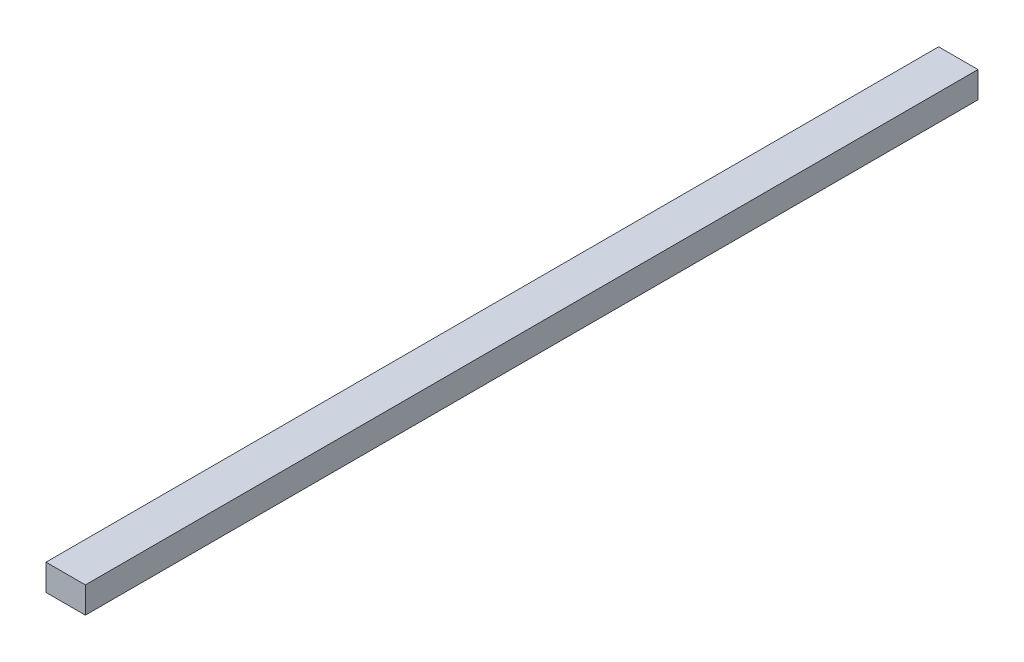
ISO-10303-21;
HEADER;
FILE_DESCRIPTION(('STEP AP214'),'2;1');
FILE_NAME('part.step','',(''),(''),'','','');
FILE_SCHEMA(('AUTOMOTIVE_DESIGN { 1 0 10303 214 1 1 1 1 }'));
ENDSEC;
DATA;
#1=APPLICATION_CONTEXT('core data for automotive mechanical design processes');
#2=APPLICATION_PROTOCOL_DEFINITION('international standard','automotive_design',2000,#1);
#3=PRODUCT_CONTEXT('',#1,'mechanical');
#4=PRODUCT('Part','Part','',(#3));
#5=PRODUCT_RELATED_PRODUCT_CATEGORY('part','',(#4));
#6=PRODUCT_DEFINITION_FORMATION('','',#4);
#7=PRODUCT_DEFINITION_CONTEXT('part definition',#1,'design');
#8=PRODUCT_DEFINITION('design','',#6,#7);
#9=PRODUCT_DEFINITION_SHAPE('','',#8);
#10=(LENGTH_UNIT() NAMED_UNIT(*) SI_UNIT(.MILLI.,.METRE.));
#11=(NAMED_UNIT(*) PLANE_ANGLE_UNIT() SI_UNIT($,.RADIAN.));
#12=(NAMED_UNIT(*) SI_UNIT($,.STERADIAN.) SOLID_ANGLE_UNIT());
#13=UNCERTAINTY_MEASURE_WITH_UNIT(LENGTH_MEASURE(1.E-05),#10,'distance_accuracy_value','');
#14=(GEOMETRIC_REPRESENTATION_CONTEXT(3) GLOBAL_UNCERTAINTY_ASSIGNED_CONTEXT((#13)) GLOBAL_UNIT_ASSIGNED_CONTEXT((#10,
#11,#12)) REPRESENTATION_CONTEXT('',''));
#15=CARTESIAN_POINT('',(0.,0.,0.));
#16=DIRECTION('',(0.,0.,1.));
#17=DIRECTION('',(1.,0.,0.));
#18=AXIS2_PLACEMENT_3D('',#15,#16,#17);
#19=CARTESIAN_POINT('',(-65.,0.,-700.));
#20=DIRECTION('',(-1.,0.,0.));
#21=DIRECTION('',(0.,0.,1.));
#22=AXIS2_PLACEMENT_3D('',#19,#20,#21);
#23=PLANE('',#22);
#24=DIRECTION('',(0.,-1.,0.));
#25=VECTOR('',#24,1.);
#26=CARTESIAN_POINT('',(-65.,0.,-20.));
#27=LINE('',#26,#25);
#28=CARTESIAN_POINT('',(-65.,20.,-20.));
#29=VERTEX_POINT('',#28);
#30=CARTESIAN_POINT('',(-65.,0.,-20.));
#31=VERTEX_POINT('',#30);
#32=EDGE_CURVE('E103',#29,#31,#27,.T.);
#33=ORIENTED_EDGE('',*,*,#32,.F.);
#34=DIRECTION('',(0.,0.,1.));
#35=VECTOR('',#34,1.);
#36=CARTESIAN_POINT('',(-65.,20.,-700.));
#37=LINE('',#36,#35);
#38=CARTESIAN_POINT('',(-65.,20.,-700.));
#39=VERTEX_POINT('',#38);
#40=EDGE_CURVE('E11',#39,#29,#37,.T.);
#41=ORIENTED_EDGE('',*,*,#40,.F.);
#42=DIRECTION('',(0.,-1.,0.));
#43=VECTOR('',#42,1.);
#44=CARTESIAN_POINT('',(-65.,0.,-700.));
#45=LINE('',#44,#43);
#46=CARTESIAN_POINT('',(-65.,0.,-700.));
#47=VERTEX_POINT('',#46);
#48=EDGE_CURVE('E97',#39,#47,#45,.T.);
#49=ORIENTED_EDGE('',*,*,#48,.T.);
#50=DIRECTION('',(0.,0.,1.));
#51=VECTOR('',#50,1.);
#52=CARTESIAN_POINT('',(-65.,0.,-700.));
#53=LINE('',#52,#51);
#54=EDGE_CURVE('E42',#47,#31,#53,.T.);
#55=ORIENTED_EDGE('',*,*,#54,.T.);
#56=EDGE_LOOP('',(#33,#41,#49,#55));
#57=FACE_BOUND('',#56,.T.);
#58=ADVANCED_FACE('F39',(#57),#23,.T.);
#59=CARTESIAN_POINT('',(-65.,20.,-700.));
#60=DIRECTION('',(0.,1.,0.));
#61=DIRECTION('',(0.,0.,1.));
#62=AXIS2_PLACEMENT_3D('',#59,#60,#61);
#63=PLANE('',#62);
#64=DIRECTION('',(-1.,0.,0.));
#65=VECTOR('',#64,1.);
#66=CARTESIAN_POINT('',(-65.,20.,-20.));
#67=LINE('',#66,#65);
#68=CARTESIAN_POINT('',(-35.,20.,-20.));
#69=VERTEX_POINT('',#68);
#70=EDGE_CURVE('E99',#69,#29,#67,.T.);
#71=ORIENTED_EDGE('',*,*,#70,.F.);
#72=DIRECTION('',(0.,0.,1.));
#73=VECTOR('',#72,1.);
#74=CARTESIAN_POINT('',(-35.,20.,-700.));
#75=LINE('',#74,#73);
#76=CARTESIAN_POINT('',(-35.,20.,-700.));
#77=VERTEX_POINT('',#76);
#78=EDGE_CURVE('E48',#77,#69,#75,.T.);
#79=ORIENTED_EDGE('',*,*,#78,.F.);
#80=DIRECTION('',(-1.,0.,0.));
#81=VECTOR('',#80,1.);
#82=CARTESIAN_POINT('',(-65.,20.,-700.));
#83=LINE('',#82,#81);
#84=EDGE_CURVE('E94',#77,#39,#83,.T.);
#85=ORIENTED_EDGE('',*,*,#84,.T.);
#86=ORIENTED_EDGE('',*,*,#40,.T.);
#87=EDGE_LOOP('',(#71,#79,#85,#86));
#88=FACE_BOUND('',#87,.T.);
#89=ADVANCED_FACE('F113',(#88),#63,.T.);
#90=CARTESIAN_POINT('',(-35.,0.,-700.));
#91=DIRECTION('',(1.,0.,0.));
#92=DIRECTION('',(0.,0.,-1.));
#93=AXIS2_PLACEMENT_3D('',#90,#91,#92);
#94=PLANE('',#93);
#95=DIRECTION('',(0.,1.,0.));
#96=VECTOR('',#95,1.);
#97=CARTESIAN_POINT('',(-35.,0.,-20.));
#98=LINE('',#97,#96);
#99=CARTESIAN_POINT('',(-35.,0.,-20.));
#100=VERTEX_POINT('',#99);
#101=EDGE_CURVE('E89',#100,#69,#98,.T.);
#102=ORIENTED_EDGE('',*,*,#101,.F.);
#103=DIRECTION('',(0.,0.,1.));
#104=VECTOR('',#103,1.);
#105=CARTESIAN_POINT('',(-35.,0.,-700.));
#106=LINE('',#105,#104);
#107=CARTESIAN_POINT('',(-35.,0.,-700.));
#108=VERTEX_POINT('',#107);
#109=EDGE_CURVE('E84',#108,#100,#106,.T.);
#110=ORIENTED_EDGE('',*,*,#109,.F.);
#111=DIRECTION('',(0.,1.,0.));
#112=VECTOR('',#111,1.);
#113=CARTESIAN_POINT('',(-35.,0.,-700.));
#114=LINE('',#113,#112);
#115=EDGE_CURVE('E87',#108,#77,#114,.T.);
#116=ORIENTED_EDGE('',*,*,#115,.T.);
#117=ORIENTED_EDGE('',*,*,#78,.T.);
#118=EDGE_LOOP('',(#102,#110,#116,#117));
#119=FACE_BOUND('',#118,.T.);
#120=ADVANCED_FACE('F86',(#119),#94,.T.);
#121=CARTESIAN_POINT('',(-65.,0.,-700.));
#122=DIRECTION('',(0.,-1.,0.));
#123=DIRECTION('',(0.,0.,-1.));
#124=AXIS2_PLACEMENT_3D('',#121,#122,#123);
#125=PLANE('',#124);
#126=DIRECTION('',(1.,0.,0.));
#127=VECTOR('',#126,1.);
#128=CARTESIAN_POINT('',(-65.,0.,-20.));
#129=LINE('',#128,#127);
#130=EDGE_CURVE('E106',#31,#100,#129,.T.);
#131=ORIENTED_EDGE('',*,*,#130,.F.);
#132=ORIENTED_EDGE('',*,*,#54,.F.);
#133=DIRECTION('',(1.,0.,0.));
#134=VECTOR('',#133,1.);
#135=CARTESIAN_POINT('',(-65.,0.,-700.));
#136=LINE('',#135,#134);
#137=EDGE_CURVE('E93',#47,#108,#136,.T.);
#138=ORIENTED_EDGE('',*,*,#137,.T.);
#139=ORIENTED_EDGE('',*,*,#109,.T.);
#140=EDGE_LOOP('',(#131,#132,#138,#139));
#141=FACE_BOUND('',#140,.T.);
#142=ADVANCED_FACE('F96',(#141),#125,.T.);
#143=CARTESIAN_POINT('',(0.,0.,-700.));
#144=DIRECTION('',(0.,0.,-1.));
#145=DIRECTION('',(-1.,0.,0.));
#146=AXIS2_PLACEMENT_3D('',#143,#144,#145);
#147=PLANE('',#146);
#148=ORIENTED_EDGE('',*,*,#48,.F.);
#149=ORIENTED_EDGE('',*,*,#84,.F.);
#150=ORIENTED_EDGE('',*,*,#115,.F.);
#151=ORIENTED_EDGE('',*,*,#137,.F.);
#152=EDGE_LOOP('',(#148,#149,#150,#151));
#153=FACE_BOUND('',#152,.T.);
#154=ADVANCED_FACE('F92',(#153),#147,.T.);
#155=CARTESIAN_POINT('',(0.,0.,-20.));
#156=DIRECTION('',(0.,0.,-1.));
#157=DIRECTION('',(-1.,0.,0.));
#158=AXIS2_PLACEMENT_3D('',#155,#156,#157);
#159=PLANE('',#158);
#160=ORIENTED_EDGE('',*,*,#32,.T.);
#161=ORIENTED_EDGE('',*,*,#130,.T.);
#162=ORIENTED_EDGE('',*,*,#101,.T.);
#163=ORIENTED_EDGE('',*,*,#70,.T.);
#164=EDGE_LOOP('',(#160,#161,#162,#163));
#165=FACE_BOUND('',#164,.T.);
#166=ADVANCED_FACE('F112',(#165),#159,.F.);
#167=CLOSED_SHELL('',(#58,#89,#120,#142,#154,#166));
#168=MANIFOLD_SOLID_BREP('B2',#167);
#169=ADVANCED_BREP_SHAPE_REPRESENTATION('',(#18,#168),#14);
#170=SHAPE_DEFINITION_REPRESENTATION(#9,#169);
ENDSEC;
END-ISO-10303-21;
